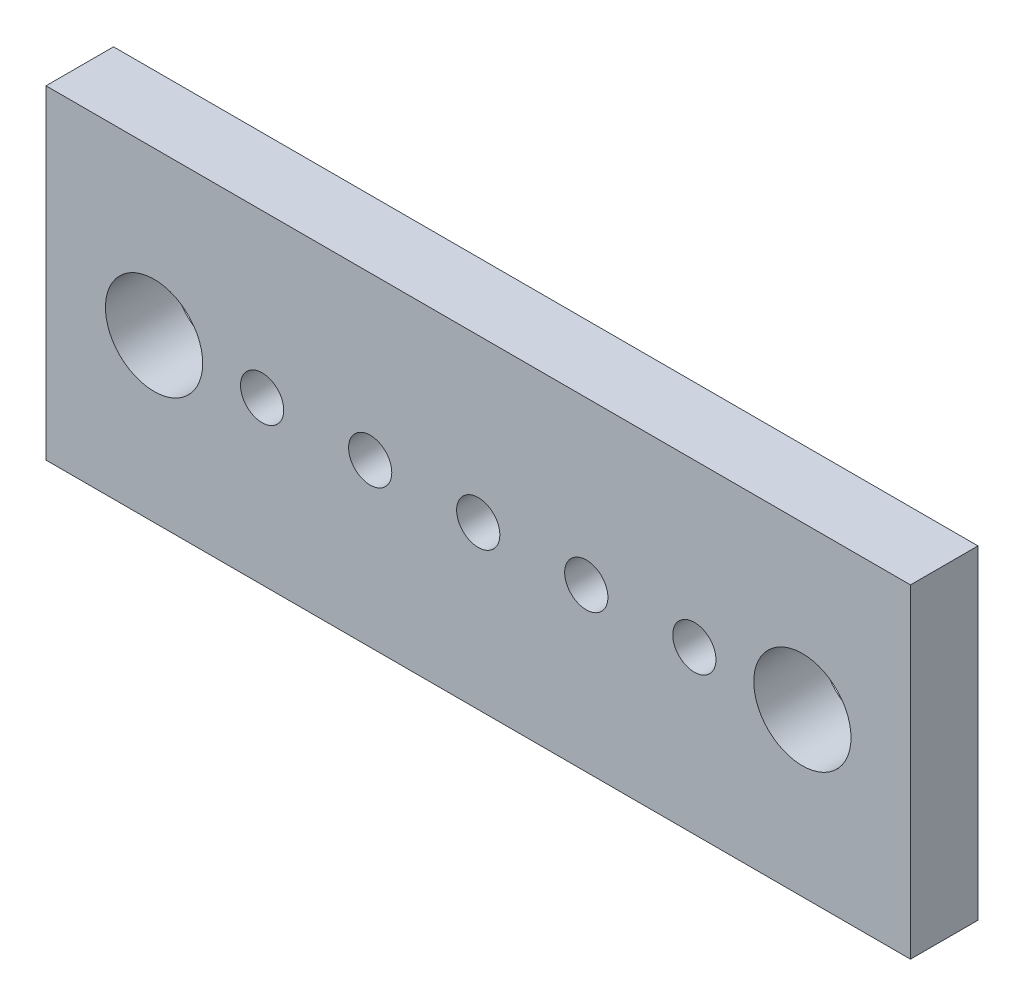
ISO-10303-21;
HEADER;
FILE_DESCRIPTION(('STEP AP214'),'2;1');
FILE_NAME('part.step','',(''),(''),'','','');
FILE_SCHEMA(('AUTOMOTIVE_DESIGN { 1 0 10303 214 1 1 1 1 }'));
ENDSEC;
DATA;
#1=APPLICATION_CONTEXT('core data for automotive mechanical design processes');
#2=APPLICATION_PROTOCOL_DEFINITION('international standard','automotive_design',2000,#1);
#3=PRODUCT_CONTEXT('',#1,'mechanical');
#4=PRODUCT('Part','Part','',(#3));
#5=PRODUCT_RELATED_PRODUCT_CATEGORY('part','',(#4));
#6=PRODUCT_DEFINITION_FORMATION('','',#4);
#7=PRODUCT_DEFINITION_CONTEXT('part definition',#1,'design');
#8=PRODUCT_DEFINITION('design','',#6,#7);
#9=PRODUCT_DEFINITION_SHAPE('','',#8);
#10=(LENGTH_UNIT() NAMED_UNIT(*) SI_UNIT(.MILLI.,.METRE.));
#11=(NAMED_UNIT(*) PLANE_ANGLE_UNIT() SI_UNIT($,.RADIAN.));
#12=(NAMED_UNIT(*) SI_UNIT($,.STERADIAN.) SOLID_ANGLE_UNIT());
#13=UNCERTAINTY_MEASURE_WITH_UNIT(LENGTH_MEASURE(1.E-05),#10,'distance_accuracy_value','');
#14=(GEOMETRIC_REPRESENTATION_CONTEXT(3) GLOBAL_UNCERTAINTY_ASSIGNED_CONTEXT((#13)) GLOBAL_UNIT_ASSIGNED_CONTEXT((#10,
#11,#12)) REPRESENTATION_CONTEXT('',''));
#15=CARTESIAN_POINT('',(0.,0.,0.));
#16=DIRECTION('',(0.,0.,1.));
#17=DIRECTION('',(1.,0.,0.));
#18=AXIS2_PLACEMENT_3D('',#15,#16,#17);
#19=CARTESIAN_POINT('',(0.,0.,1.5875));
#20=DIRECTION('',(0.,0.,-1.));
#21=DIRECTION('',(-1.,0.,0.));
#22=AXIS2_PLACEMENT_3D('',#19,#20,#21);
#23=PLANE('',#22);
#24=CARTESIAN_POINT('',(2.54,3.81,1.5875));
#25=DIRECTION('',(0.,0.,1.));
#26=DIRECTION('',(1.,0.,0.));
#27=AXIS2_PLACEMENT_3D('',#24,#25,#26);
#28=CIRCLE('',#27,1.143);
#29=CARTESIAN_POINT('',(3.683,3.81,1.5875));
#30=VERTEX_POINT('',#29);
#31=EDGE_CURVE('E178',#30,#30,#28,.T.);
#32=ORIENTED_EDGE('',*,*,#31,.F.);
#33=EDGE_LOOP('',(#32));
#34=FACE_BOUND('',#33,.T.);
#35=CARTESIAN_POINT('',(17.78,3.81,1.5875));
#36=DIRECTION('',(0.,0.,1.));
#37=DIRECTION('',(1.,0.,0.));
#38=AXIS2_PLACEMENT_3D('',#35,#36,#37);
#39=CIRCLE('',#38,1.143);
#40=CARTESIAN_POINT('',(18.923,3.81,1.5875));
#41=VERTEX_POINT('',#40);
#42=EDGE_CURVE('E170',#41,#41,#39,.T.);
#43=ORIENTED_EDGE('',*,*,#42,.F.);
#44=EDGE_LOOP('',(#43));
#45=FACE_BOUND('',#44,.T.);
#46=DIRECTION('',(0.,-1.,0.));
#47=VECTOR('',#46,1.);
#48=CARTESIAN_POINT('',(0.,0.,1.5875));
#49=LINE('',#48,#47);
#50=CARTESIAN_POINT('',(0.,7.62,1.5875));
#51=VERTEX_POINT('',#50);
#52=CARTESIAN_POINT('',(0.,0.,1.5875));
#53=VERTEX_POINT('',#52);
#54=EDGE_CURVE('E92',#51,#53,#49,.T.);
#55=ORIENTED_EDGE('',*,*,#54,.T.);
#56=DIRECTION('',(1.,0.,0.));
#57=VECTOR('',#56,1.);
#58=CARTESIAN_POINT('',(0.,0.,1.5875));
#59=LINE('',#58,#57);
#60=CARTESIAN_POINT('',(20.32,0.,1.5875));
#61=VERTEX_POINT('',#60);
#62=EDGE_CURVE('E87',#53,#61,#59,.T.);
#63=ORIENTED_EDGE('',*,*,#62,.T.);
#64=DIRECTION('',(0.,1.,0.));
#65=VECTOR('',#64,1.);
#66=CARTESIAN_POINT('',(20.32,0.,1.5875));
#67=LINE('',#66,#65);
#68=CARTESIAN_POINT('',(20.32,7.62,1.5875));
#69=VERTEX_POINT('',#68);
#70=EDGE_CURVE('E90',#61,#69,#67,.T.);
#71=ORIENTED_EDGE('',*,*,#70,.T.);
#72=DIRECTION('',(-1.,0.,0.));
#73=VECTOR('',#72,1.);
#74=CARTESIAN_POINT('',(0.,7.62,1.5875));
#75=LINE('',#74,#73);
#76=EDGE_CURVE('E57',#69,#51,#75,.T.);
#77=ORIENTED_EDGE('',*,*,#76,.T.);
#78=EDGE_LOOP('',(#55,#63,#71,#77));
#79=FACE_BOUND('',#78,.T.);
#80=CARTESIAN_POINT('',(5.08,3.81,1.5875));
#81=DIRECTION('',(0.,0.,1.));
#82=DIRECTION('',(1.,0.,0.));
#83=AXIS2_PLACEMENT_3D('',#80,#81,#82);
#84=CIRCLE('',#83,0.508);
#85=CARTESIAN_POINT('',(5.588,3.81,1.5875));
#86=VERTEX_POINT('',#85);
#87=EDGE_CURVE('E112',#86,#86,#84,.T.);
#88=ORIENTED_EDGE('',*,*,#87,.F.);
#89=EDGE_LOOP('',(#88));
#90=FACE_BOUND('',#89,.T.);
#91=CARTESIAN_POINT('',(7.62,3.81,1.5875));
#92=DIRECTION('',(0.,0.,1.));
#93=DIRECTION('',(1.,0.,0.));
#94=AXIS2_PLACEMENT_3D('',#91,#92,#93);
#95=CIRCLE('',#94,0.508);
#96=CARTESIAN_POINT('',(8.128,3.81,1.5875));
#97=VERTEX_POINT('',#96);
#98=EDGE_CURVE('E134',#97,#97,#95,.T.);
#99=ORIENTED_EDGE('',*,*,#98,.F.);
#100=EDGE_LOOP('',(#99));
#101=FACE_BOUND('',#100,.T.);
#102=CARTESIAN_POINT('',(10.16,3.81,1.5875));
#103=DIRECTION('',(0.,0.,1.));
#104=DIRECTION('',(1.,0.,0.));
#105=AXIS2_PLACEMENT_3D('',#102,#103,#104);
#106=CIRCLE('',#105,0.508);
#107=CARTESIAN_POINT('',(10.668,3.81,1.5875));
#108=VERTEX_POINT('',#107);
#109=EDGE_CURVE('E142',#108,#108,#106,.T.);
#110=ORIENTED_EDGE('',*,*,#109,.F.);
#111=EDGE_LOOP('',(#110));
#112=FACE_BOUND('',#111,.T.);
#113=CARTESIAN_POINT('',(12.7,3.81,1.5875));
#114=DIRECTION('',(0.,0.,1.));
#115=DIRECTION('',(1.,0.,0.));
#116=AXIS2_PLACEMENT_3D('',#113,#114,#115);
#117=CIRCLE('',#116,0.508000000000002);
#118=CARTESIAN_POINT('',(13.208,3.81,1.5875));
#119=VERTEX_POINT('',#118);
#120=EDGE_CURVE('E150',#119,#119,#117,.T.);
#121=ORIENTED_EDGE('',*,*,#120,.F.);
#122=EDGE_LOOP('',(#121));
#123=FACE_BOUND('',#122,.T.);
#124=CARTESIAN_POINT('',(15.24,3.81,1.5875));
#125=DIRECTION('',(0.,0.,1.));
#126=DIRECTION('',(1.,0.,0.));
#127=AXIS2_PLACEMENT_3D('',#124,#125,#126);
#128=CIRCLE('',#127,0.508000000000002);
#129=CARTESIAN_POINT('',(15.748,3.81,1.5875));
#130=VERTEX_POINT('',#129);
#131=EDGE_CURVE('E158',#130,#130,#128,.T.);
#132=ORIENTED_EDGE('',*,*,#131,.F.);
#133=EDGE_LOOP('',(#132));
#134=FACE_BOUND('',#133,.T.);
#135=ADVANCED_FACE('F39',(#34,#45,#79,#90,#101,#112,#123,#134),#23,.F.);
#136=CARTESIAN_POINT('',(0.,0.,0.));
#137=DIRECTION('',(0.,0.,-1.));
#138=DIRECTION('',(-1.,0.,0.));
#139=AXIS2_PLACEMENT_3D('',#136,#137,#138);
#140=PLANE('',#139);
#141=CARTESIAN_POINT('',(2.54,3.81,0.));
#142=DIRECTION('',(0.,0.,1.));
#143=DIRECTION('',(1.,0.,0.));
#144=AXIS2_PLACEMENT_3D('',#141,#142,#143);
#145=CIRCLE('',#144,1.143);
#146=CARTESIAN_POINT('',(3.683,3.81,0.));
#147=VERTEX_POINT('',#146);
#148=EDGE_CURVE('E166',#147,#147,#145,.T.);
#149=ORIENTED_EDGE('',*,*,#148,.T.);
#150=EDGE_LOOP('',(#149));
#151=FACE_BOUND('',#150,.T.);
#152=CARTESIAN_POINT('',(17.78,3.81,0.));
#153=DIRECTION('',(0.,0.,1.));
#154=DIRECTION('',(1.,0.,0.));
#155=AXIS2_PLACEMENT_3D('',#152,#153,#154);
#156=CIRCLE('',#155,1.143);
#157=CARTESIAN_POINT('',(18.923,3.81,0.));
#158=VERTEX_POINT('',#157);
#159=EDGE_CURVE('E174',#158,#158,#156,.T.);
#160=ORIENTED_EDGE('',*,*,#159,.T.);
#161=EDGE_LOOP('',(#160));
#162=FACE_BOUND('',#161,.T.);
#163=CARTESIAN_POINT('',(15.24,3.81,0.));
#164=DIRECTION('',(0.,0.,1.));
#165=DIRECTION('',(1.,0.,0.));
#166=AXIS2_PLACEMENT_3D('',#163,#164,#165);
#167=CIRCLE('',#166,0.508000000000002);
#168=CARTESIAN_POINT('',(15.748,3.81,0.));
#169=VERTEX_POINT('',#168);
#170=EDGE_CURVE('E162',#169,#169,#167,.T.);
#171=ORIENTED_EDGE('',*,*,#170,.T.);
#172=EDGE_LOOP('',(#171));
#173=FACE_BOUND('',#172,.T.);
#174=CARTESIAN_POINT('',(10.16,3.81,0.));
#175=DIRECTION('',(0.,0.,1.));
#176=DIRECTION('',(1.,0.,0.));
#177=AXIS2_PLACEMENT_3D('',#174,#175,#176);
#178=CIRCLE('',#177,0.508);
#179=CARTESIAN_POINT('',(10.668,3.81,0.));
#180=VERTEX_POINT('',#179);
#181=EDGE_CURVE('E146',#180,#180,#178,.T.);
#182=ORIENTED_EDGE('',*,*,#181,.T.);
#183=EDGE_LOOP('',(#182));
#184=FACE_BOUND('',#183,.T.);
#185=CARTESIAN_POINT('',(5.08,3.81,0.));
#186=DIRECTION('',(0.,0.,1.));
#187=DIRECTION('',(1.,0.,0.));
#188=AXIS2_PLACEMENT_3D('',#185,#186,#187);
#189=CIRCLE('',#188,0.508);
#190=CARTESIAN_POINT('',(5.588,3.81,0.));
#191=VERTEX_POINT('',#190);
#192=EDGE_CURVE('E130',#191,#191,#189,.T.);
#193=ORIENTED_EDGE('',*,*,#192,.T.);
#194=EDGE_LOOP('',(#193));
#195=FACE_BOUND('',#194,.T.);
#196=DIRECTION('',(0.,-1.,0.));
#197=VECTOR('',#196,1.);
#198=CARTESIAN_POINT('',(0.,0.,0.));
#199=LINE('',#198,#197);
#200=CARTESIAN_POINT('',(0.,7.62,0.));
#201=VERTEX_POINT('',#200);
#202=CARTESIAN_POINT('',(0.,0.,0.));
#203=VERTEX_POINT('',#202);
#204=EDGE_CURVE('E108',#201,#203,#199,.T.);
#205=ORIENTED_EDGE('',*,*,#204,.F.);
#206=DIRECTION('',(-1.,0.,0.));
#207=VECTOR('',#206,1.);
#208=CARTESIAN_POINT('',(0.,7.62,0.));
#209=LINE('',#208,#207);
#210=CARTESIAN_POINT('',(20.32,7.62,0.));
#211=VERTEX_POINT('',#210);
#212=EDGE_CURVE('E80',#211,#201,#209,.T.);
#213=ORIENTED_EDGE('',*,*,#212,.F.);
#214=DIRECTION('',(0.,1.,0.));
#215=VECTOR('',#214,1.);
#216=CARTESIAN_POINT('',(20.32,0.,0.));
#217=LINE('',#216,#215);
#218=CARTESIAN_POINT('',(20.32,0.,0.));
#219=VERTEX_POINT('',#218);
#220=EDGE_CURVE('E74',#219,#211,#217,.T.);
#221=ORIENTED_EDGE('',*,*,#220,.F.);
#222=DIRECTION('',(1.,0.,0.));
#223=VECTOR('',#222,1.);
#224=CARTESIAN_POINT('',(0.,0.,0.));
#225=LINE('',#224,#223);
#226=EDGE_CURVE('E97',#203,#219,#225,.T.);
#227=ORIENTED_EDGE('',*,*,#226,.F.);
#228=EDGE_LOOP('',(#205,#213,#221,#227));
#229=FACE_BOUND('',#228,.T.);
#230=CARTESIAN_POINT('',(7.62,3.81,0.));
#231=DIRECTION('',(0.,0.,1.));
#232=DIRECTION('',(1.,0.,0.));
#233=AXIS2_PLACEMENT_3D('',#230,#231,#232);
#234=CIRCLE('',#233,0.508);
#235=CARTESIAN_POINT('',(8.128,3.81,0.));
#236=VERTEX_POINT('',#235);
#237=EDGE_CURVE('E138',#236,#236,#234,.T.);
#238=ORIENTED_EDGE('',*,*,#237,.T.);
#239=EDGE_LOOP('',(#238));
#240=FACE_BOUND('',#239,.T.);
#241=CARTESIAN_POINT('',(12.7,3.81,0.));
#242=DIRECTION('',(0.,0.,1.));
#243=DIRECTION('',(1.,0.,0.));
#244=AXIS2_PLACEMENT_3D('',#241,#242,#243);
#245=CIRCLE('',#244,0.508000000000002);
#246=CARTESIAN_POINT('',(13.208,3.81,0.));
#247=VERTEX_POINT('',#246);
#248=EDGE_CURVE('E154',#247,#247,#245,.T.);
#249=ORIENTED_EDGE('',*,*,#248,.T.);
#250=EDGE_LOOP('',(#249));
#251=FACE_BOUND('',#250,.T.);
#252=ADVANCED_FACE('F125',(#151,#162,#173,#184,#195,#229,#240,#251),#140,.T.);
#253=CARTESIAN_POINT('',(0.,0.,1.5875));
#254=DIRECTION('',(1.,0.,0.));
#255=DIRECTION('',(0.,0.,-1.));
#256=AXIS2_PLACEMENT_3D('',#253,#254,#255);
#257=PLANE('',#256);
#258=ORIENTED_EDGE('',*,*,#204,.T.);
#259=DIRECTION('',(0.,0.,-1.));
#260=VECTOR('',#259,1.);
#261=CARTESIAN_POINT('',(0.,0.,1.5875));
#262=LINE('',#261,#260);
#263=EDGE_CURVE('E11',#53,#203,#262,.T.);
#264=ORIENTED_EDGE('',*,*,#263,.F.);
#265=ORIENTED_EDGE('',*,*,#54,.F.);
#266=DIRECTION('',(0.,0.,-1.));
#267=VECTOR('',#266,1.);
#268=CARTESIAN_POINT('',(0.,7.62,1.5875));
#269=LINE('',#268,#267);
#270=EDGE_CURVE('E104',#51,#201,#269,.T.);
#271=ORIENTED_EDGE('',*,*,#270,.T.);
#272=EDGE_LOOP('',(#258,#264,#265,#271));
#273=FACE_BOUND('',#272,.T.);
#274=ADVANCED_FACE('F41',(#273),#257,.F.);
#275=CARTESIAN_POINT('',(0.,0.,1.5875));
#276=DIRECTION('',(0.,1.,0.));
#277=DIRECTION('',(0.,0.,1.));
#278=AXIS2_PLACEMENT_3D('',#275,#276,#277);
#279=PLANE('',#278);
#280=ORIENTED_EDGE('',*,*,#226,.T.);
#281=DIRECTION('',(0.,0.,-1.));
#282=VECTOR('',#281,1.);
#283=CARTESIAN_POINT('',(20.32,0.,1.5875));
#284=LINE('',#283,#282);
#285=EDGE_CURVE('E49',#61,#219,#284,.T.);
#286=ORIENTED_EDGE('',*,*,#285,.F.);
#287=ORIENTED_EDGE('',*,*,#62,.F.);
#288=ORIENTED_EDGE('',*,*,#263,.T.);
#289=EDGE_LOOP('',(#280,#286,#287,#288));
#290=FACE_BOUND('',#289,.T.);
#291=ADVANCED_FACE('F96',(#290),#279,.F.);
#292=CARTESIAN_POINT('',(20.32,0.,1.5875));
#293=DIRECTION('',(-1.,0.,0.));
#294=DIRECTION('',(0.,0.,1.));
#295=AXIS2_PLACEMENT_3D('',#292,#293,#294);
#296=PLANE('',#295);
#297=ORIENTED_EDGE('',*,*,#220,.T.);
#298=DIRECTION('',(0.,0.,-1.));
#299=VECTOR('',#298,1.);
#300=CARTESIAN_POINT('',(20.32,7.62,1.5875));
#301=LINE('',#300,#299);
#302=EDGE_CURVE('E99',#69,#211,#301,.T.);
#303=ORIENTED_EDGE('',*,*,#302,.F.);
#304=ORIENTED_EDGE('',*,*,#70,.F.);
#305=ORIENTED_EDGE('',*,*,#285,.T.);
#306=EDGE_LOOP('',(#297,#303,#304,#305));
#307=FACE_BOUND('',#306,.T.);
#308=ADVANCED_FACE('F100',(#307),#296,.F.);
#309=CARTESIAN_POINT('',(0.,7.62,1.5875));
#310=DIRECTION('',(0.,-1.,0.));
#311=DIRECTION('',(0.,0.,-1.));
#312=AXIS2_PLACEMENT_3D('',#309,#310,#311);
#313=PLANE('',#312);
#314=ORIENTED_EDGE('',*,*,#212,.T.);
#315=ORIENTED_EDGE('',*,*,#270,.F.);
#316=ORIENTED_EDGE('',*,*,#76,.F.);
#317=ORIENTED_EDGE('',*,*,#302,.T.);
#318=EDGE_LOOP('',(#314,#315,#316,#317));
#319=FACE_BOUND('',#318,.T.);
#320=ADVANCED_FACE('F122',(#319),#313,.F.);
#321=CARTESIAN_POINT('',(5.08,3.81,1.5875));
#322=DIRECTION('',(0.,0.,-1.));
#323=DIRECTION('',(-1.,0.,0.));
#324=AXIS2_PLACEMENT_3D('',#321,#322,#323);
#325=CYLINDRICAL_SURFACE('',#324,0.508);
#326=ORIENTED_EDGE('',*,*,#87,.T.);
#327=EDGE_LOOP('',(#326));
#328=FACE_BOUND('',#327,.T.);
#329=ORIENTED_EDGE('',*,*,#192,.F.);
#330=EDGE_LOOP('',(#329));
#331=FACE_BOUND('',#330,.T.);
#332=ADVANCED_FACE('F222',(#328,#331),#325,.F.);
#333=CARTESIAN_POINT('',(7.62,3.81,1.5875));
#334=DIRECTION('',(0.,0.,-1.));
#335=DIRECTION('',(-1.,0.,0.));
#336=AXIS2_PLACEMENT_3D('',#333,#334,#335);
#337=CYLINDRICAL_SURFACE('',#336,0.508);
#338=ORIENTED_EDGE('',*,*,#98,.T.);
#339=EDGE_LOOP('',(#338));
#340=FACE_BOUND('',#339,.T.);
#341=ORIENTED_EDGE('',*,*,#237,.F.);
#342=EDGE_LOOP('',(#341));
#343=FACE_BOUND('',#342,.T.);
#344=ADVANCED_FACE('F218',(#340,#343),#337,.F.);
#345=CARTESIAN_POINT('',(10.16,3.81,1.5875));
#346=DIRECTION('',(0.,0.,-1.));
#347=DIRECTION('',(-1.,0.,0.));
#348=AXIS2_PLACEMENT_3D('',#345,#346,#347);
#349=CYLINDRICAL_SURFACE('',#348,0.508);
#350=ORIENTED_EDGE('',*,*,#109,.T.);
#351=EDGE_LOOP('',(#350));
#352=FACE_BOUND('',#351,.T.);
#353=ORIENTED_EDGE('',*,*,#181,.F.);
#354=EDGE_LOOP('',(#353));
#355=FACE_BOUND('',#354,.T.);
#356=ADVANCED_FACE('F214',(#352,#355),#349,.F.);
#357=CARTESIAN_POINT('',(12.7,3.81,1.5875));
#358=DIRECTION('',(0.,0.,-1.));
#359=DIRECTION('',(-1.,0.,0.));
#360=AXIS2_PLACEMENT_3D('',#357,#358,#359);
#361=CYLINDRICAL_SURFACE('',#360,0.508000000000002);
#362=ORIENTED_EDGE('',*,*,#120,.T.);
#363=EDGE_LOOP('',(#362));
#364=FACE_BOUND('',#363,.T.);
#365=ORIENTED_EDGE('',*,*,#248,.F.);
#366=EDGE_LOOP('',(#365));
#367=FACE_BOUND('',#366,.T.);
#368=ADVANCED_FACE('F207',(#364,#367),#361,.F.);
#369=CARTESIAN_POINT('',(15.24,3.81,1.5875));
#370=DIRECTION('',(0.,0.,-1.));
#371=DIRECTION('',(-1.,0.,0.));
#372=AXIS2_PLACEMENT_3D('',#369,#370,#371);
#373=CYLINDRICAL_SURFACE('',#372,0.508000000000002);
#374=ORIENTED_EDGE('',*,*,#131,.T.);
#375=EDGE_LOOP('',(#374));
#376=FACE_BOUND('',#375,.T.);
#377=ORIENTED_EDGE('',*,*,#170,.F.);
#378=EDGE_LOOP('',(#377));
#379=FACE_BOUND('',#378,.T.);
#380=ADVANCED_FACE('F201',(#376,#379),#373,.F.);
#381=CARTESIAN_POINT('',(17.78,3.81,0.));
#382=DIRECTION('',(0.,0.,1.));
#383=DIRECTION('',(1.,0.,0.));
#384=AXIS2_PLACEMENT_3D('',#381,#382,#383);
#385=CYLINDRICAL_SURFACE('',#384,1.143);
#386=ORIENTED_EDGE('',*,*,#159,.F.);
#387=EDGE_LOOP('',(#386));
#388=FACE_BOUND('',#387,.T.);
#389=ORIENTED_EDGE('',*,*,#42,.T.);
#390=EDGE_LOOP('',(#389));
#391=FACE_BOUND('',#390,.T.);
#392=ADVANCED_FACE('F191',(#388,#391),#385,.F.);
#393=CARTESIAN_POINT('',(2.54,3.81,0.));
#394=DIRECTION('',(0.,0.,1.));
#395=DIRECTION('',(1.,0.,0.));
#396=AXIS2_PLACEMENT_3D('',#393,#394,#395);
#397=CYLINDRICAL_SURFACE('',#396,1.143);
#398=ORIENTED_EDGE('',*,*,#148,.F.);
#399=EDGE_LOOP('',(#398));
#400=FACE_BOUND('',#399,.T.);
#401=ORIENTED_EDGE('',*,*,#31,.T.);
#402=EDGE_LOOP('',(#401));
#403=FACE_BOUND('',#402,.T.);
#404=ADVANCED_FACE('F188',(#400,#403),#397,.F.);
#405=CLOSED_SHELL('',(#135,#252,#274,#291,#308,#320,#332,#344,#356,#368,#380,#392,#404));
#406=MANIFOLD_SOLID_BREP('B2',#405);
#407=ADVANCED_BREP_SHAPE_REPRESENTATION('',(#18,#406),#14);
#408=SHAPE_DEFINITION_REPRESENTATION(#9,#407);
ENDSEC;
END-ISO-10303-21;
